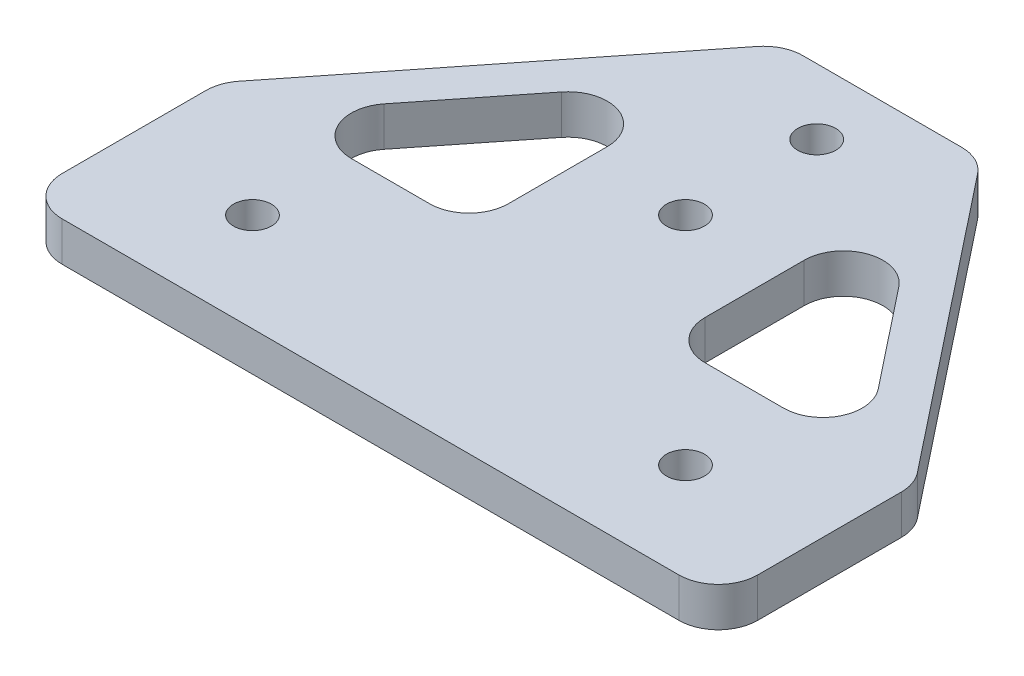
ISO-10303-21;
HEADER;
FILE_DESCRIPTION(('STEP AP214'),'2;1');
FILE_NAME('part.step','',(''),(''),'','','');
FILE_SCHEMA(('AUTOMOTIVE_DESIGN { 1 0 10303 214 1 1 1 1 }'));
ENDSEC;
DATA;
#1=APPLICATION_CONTEXT('core data for automotive mechanical design processes');
#2=APPLICATION_PROTOCOL_DEFINITION('international standard','automotive_design',2000,#1);
#3=PRODUCT_CONTEXT('',#1,'mechanical');
#4=PRODUCT('Part','Part','',(#3));
#5=PRODUCT_RELATED_PRODUCT_CATEGORY('part','',(#4));
#6=PRODUCT_DEFINITION_FORMATION('','',#4);
#7=PRODUCT_DEFINITION_CONTEXT('part definition',#1,'design');
#8=PRODUCT_DEFINITION('design','',#6,#7);
#9=PRODUCT_DEFINITION_SHAPE('','',#8);
#10=(LENGTH_UNIT() NAMED_UNIT(*) SI_UNIT(.MILLI.,.METRE.));
#11=(NAMED_UNIT(*) PLANE_ANGLE_UNIT() SI_UNIT($,.RADIAN.));
#12=(NAMED_UNIT(*) SI_UNIT($,.STERADIAN.) SOLID_ANGLE_UNIT());
#13=UNCERTAINTY_MEASURE_WITH_UNIT(LENGTH_MEASURE(1.E-05),#10,'distance_accuracy_value','');
#14=(GEOMETRIC_REPRESENTATION_CONTEXT(3) GLOBAL_UNCERTAINTY_ASSIGNED_CONTEXT((#13)) GLOBAL_UNIT_ASSIGNED_CONTEXT((#10,
#11,#12)) REPRESENTATION_CONTEXT('',''));
#15=CARTESIAN_POINT('',(0.,0.,0.));
#16=DIRECTION('',(0.,0.,1.));
#17=DIRECTION('',(1.,0.,0.));
#18=AXIS2_PLACEMENT_3D('',#15,#16,#17);
#19=CARTESIAN_POINT('',(0.,3.,-7.5));
#20=DIRECTION('',(0.,0.,1.));
#21=DIRECTION('',(1.,0.,0.));
#22=AXIS2_PLACEMENT_3D('',#19,#20,#21);
#23=PLANE('',#22);
#24=DIRECTION('',(-1.,0.,0.));
#25=VECTOR('',#24,1.);
#26=CARTESIAN_POINT('',(0.,3.,-7.5));
#27=LINE('',#26,#25);
#28=CARTESIAN_POINT('',(16.472386067493,3.,-7.5));
#29=VERTEX_POINT('',#28);
#30=CARTESIAN_POINT('',(10.5,3.,-7.5));
#31=VERTEX_POINT('',#30);
#32=EDGE_CURVE('E224',#29,#31,#27,.T.);
#33=ORIENTED_EDGE('',*,*,#32,.F.);
#34=DIRECTION('',(0.,-1.,0.));
#35=VECTOR('',#34,1.);
#36=CARTESIAN_POINT('',(16.472386067493,0.,-7.5));
#37=LINE('',#36,#35);
#38=CARTESIAN_POINT('',(16.472386067493,0.,-7.5));
#39=VERTEX_POINT('',#38);
#40=EDGE_CURVE('E209',#29,#39,#37,.T.);
#41=ORIENTED_EDGE('',*,*,#40,.T.);
#42=DIRECTION('',(-1.,0.,0.));
#43=VECTOR('',#42,1.);
#44=CARTESIAN_POINT('',(0.,0.,-7.5));
#45=LINE('',#44,#43);
#46=CARTESIAN_POINT('',(10.5,0.,-7.5));
#47=VERTEX_POINT('',#46);
#48=EDGE_CURVE('E221',#39,#47,#45,.T.);
#49=ORIENTED_EDGE('',*,*,#48,.T.);
#50=DIRECTION('',(0.,-1.,0.));
#51=VECTOR('',#50,1.);
#52=CARTESIAN_POINT('',(10.5,3.,-7.5));
#53=LINE('',#52,#51);
#54=EDGE_CURVE('E226',#47,#31,#53,.F.);
#55=ORIENTED_EDGE('',*,*,#54,.T.);
#56=EDGE_LOOP('',(#33,#41,#49,#55));
#57=FACE_BOUND('',#56,.T.);
#58=ADVANCED_FACE('F43',(#57),#23,.F.);
#59=CARTESIAN_POINT('',(7.5,3.,0.));
#60=DIRECTION('',(-1.,0.,0.));
#61=DIRECTION('',(0.,0.,1.));
#62=AXIS2_PLACEMENT_3D('',#59,#60,#61);
#63=PLANE('',#62);
#64=DIRECTION('',(0.,0.,-1.));
#65=VECTOR('',#64,1.);
#66=CARTESIAN_POINT('',(7.5,0.,0.));
#67=LINE('',#66,#65);
#68=CARTESIAN_POINT('',(7.50000000000001,0.,-10.5));
#69=VERTEX_POINT('',#68);
#70=CARTESIAN_POINT('',(7.50000000000001,0.,-18.0440666115701));
#71=VERTEX_POINT('',#70);
#72=EDGE_CURVE('E230',#69,#71,#67,.T.);
#73=ORIENTED_EDGE('',*,*,#72,.T.);
#74=DIRECTION('',(0.,-1.,0.));
#75=VECTOR('',#74,1.);
#76=CARTESIAN_POINT('',(7.50000000000001,3.,-18.0440666115701));
#77=LINE('',#76,#75);
#78=CARTESIAN_POINT('',(7.50000000000001,3.,-18.0440666115701));
#79=VERTEX_POINT('',#78);
#80=EDGE_CURVE('E251',#71,#79,#77,.F.);
#81=ORIENTED_EDGE('',*,*,#80,.T.);
#82=DIRECTION('',(0.,0.,-1.));
#83=VECTOR('',#82,1.);
#84=CARTESIAN_POINT('',(7.5,3.,0.));
#85=LINE('',#84,#83);
#86=CARTESIAN_POINT('',(7.50000000000001,3.,-10.5));
#87=VERTEX_POINT('',#86);
#88=EDGE_CURVE('E410',#87,#79,#85,.T.);
#89=ORIENTED_EDGE('',*,*,#88,.F.);
#90=DIRECTION('',(0.,-1.,0.));
#91=VECTOR('',#90,1.);
#92=CARTESIAN_POINT('',(7.50000000000001,0.,-10.5));
#93=LINE('',#92,#91);
#94=EDGE_CURVE('E248',#87,#69,#93,.T.);
#95=ORIENTED_EDGE('',*,*,#94,.T.);
#96=EDGE_LOOP('',(#73,#81,#89,#95));
#97=FACE_BOUND('',#96,.T.);
#98=ADVANCED_FACE('F448',(#97),#63,.F.);
#99=CARTESIAN_POINT('',(19.940234791889,3.,-15.7860192102455));
#100=DIRECTION('',(0.784045824461762,0.,-0.620702944365561));
#101=DIRECTION('',(-0.620702944365561,0.,-0.784045824461762));
#102=AXIS2_PLACEMENT_3D('',#99,#100,#101);
#103=PLANE('',#102);
#104=DIRECTION('',(0.620702944365561,0.,0.784045824461762));
#105=VECTOR('',#104,1.);
#106=CARTESIAN_POINT('',(19.940234791889,0.,-15.7860192102455));
#107=LINE('',#106,#105);
#108=CARTESIAN_POINT('',(8.40083050713179,0.,-30.3621088330967));
#109=VERTEX_POINT('',#108);
#110=CARTESIAN_POINT('',(25.8521374733853,0.,-8.31835266519753));
#111=VERTEX_POINT('',#110);
#112=EDGE_CURVE('E376',#109,#111,#107,.T.);
#113=ORIENTED_EDGE('',*,*,#112,.F.);
#114=DIRECTION('',(0.,-1.,0.));
#115=VECTOR('',#114,1.);
#116=CARTESIAN_POINT('',(8.40083050713179,3.,-30.3621088330967));
#117=LINE('',#116,#115);
#118=CARTESIAN_POINT('',(8.40083050713179,3.,-30.3621088330967));
#119=VERTEX_POINT('',#118);
#120=EDGE_CURVE('E303',#109,#119,#117,.F.);
#121=ORIENTED_EDGE('',*,*,#120,.T.);
#122=DIRECTION('',(0.620702944365561,0.,0.784045824461762));
#123=VECTOR('',#122,1.);
#124=CARTESIAN_POINT('',(19.940234791889,3.,-15.7860192102455));
#125=LINE('',#124,#123);
#126=CARTESIAN_POINT('',(25.8521374733853,3.,-8.31835266519753));
#127=VERTEX_POINT('',#126);
#128=EDGE_CURVE('E732',#119,#127,#125,.T.);
#129=ORIENTED_EDGE('',*,*,#128,.T.);
#130=DIRECTION('',(0.,-1.,0.));
#131=VECTOR('',#130,1.);
#132=CARTESIAN_POINT('',(25.8521374733853,0.,-8.31835266519753));
#133=LINE('',#132,#131);
#134=EDGE_CURVE('E300',#127,#111,#133,.T.);
#135=ORIENTED_EDGE('',*,*,#134,.T.);
#136=EDGE_LOOP('',(#113,#121,#129,#135));
#137=FACE_BOUND('',#136,.T.);
#138=ADVANCED_FACE('F454',(#137),#103,.T.);
#139=CARTESIAN_POINT('',(0.,3.,-31.5));
#140=DIRECTION('',(0.,0.,-1.));
#141=DIRECTION('',(-1.,0.,0.));
#142=AXIS2_PLACEMENT_3D('',#139,#140,#141);
#143=PLANE('',#142);
#144=DIRECTION('',(1.,0.,0.));
#145=VECTOR('',#144,1.);
#146=CARTESIAN_POINT('',(0.,0.,-31.5));
#147=LINE('',#146,#145);
#148=CARTESIAN_POINT('',(-6.04869303374651,0.,-31.5));
#149=VERTEX_POINT('',#148);
#150=CARTESIAN_POINT('',(6.0486930337465,0.,-31.5));
#151=VERTEX_POINT('',#150);
#152=EDGE_CURVE('E379',#149,#151,#147,.T.);
#153=ORIENTED_EDGE('',*,*,#152,.F.);
#154=DIRECTION('',(0.,-1.,0.));
#155=VECTOR('',#154,1.);
#156=CARTESIAN_POINT('',(-6.04869303374651,3.,-31.5));
#157=LINE('',#156,#155);
#158=CARTESIAN_POINT('',(-6.04869303374651,3.,-31.5));
#159=VERTEX_POINT('',#158);
#160=EDGE_CURVE('E298',#149,#159,#157,.F.);
#161=ORIENTED_EDGE('',*,*,#160,.T.);
#162=DIRECTION('',(1.,0.,0.));
#163=VECTOR('',#162,1.);
#164=CARTESIAN_POINT('',(0.,3.,-31.5));
#165=LINE('',#164,#163);
#166=CARTESIAN_POINT('',(6.0486930337465,3.,-31.5));
#167=VERTEX_POINT('',#166);
#168=EDGE_CURVE('E735',#159,#167,#165,.T.);
#169=ORIENTED_EDGE('',*,*,#168,.T.);
#170=DIRECTION('',(0.,-1.,0.));
#171=VECTOR('',#170,1.);
#172=CARTESIAN_POINT('',(6.0486930337465,3.,-31.5));
#173=LINE('',#172,#171);
#174=EDGE_CURVE('E295',#167,#151,#173,.T.);
#175=ORIENTED_EDGE('',*,*,#174,.T.);
#176=EDGE_LOOP('',(#153,#161,#169,#175));
#177=FACE_BOUND('',#176,.T.);
#178=ADVANCED_FACE('F469',(#177),#143,.T.);
#179=CARTESIAN_POINT('',(-19.940234791889,3.,-15.7860192102455));
#180=DIRECTION('',(-0.784045824461761,0.,-0.620702944365561));
#181=DIRECTION('',(-0.620702944365561,0.,0.784045824461762));
#182=AXIS2_PLACEMENT_3D('',#179,#180,#181);
#183=PLANE('',#182);
#184=DIRECTION('',(0.620702944365561,0.,-0.784045824461762));
#185=VECTOR('',#184,1.);
#186=CARTESIAN_POINT('',(-19.940234791889,0.,-15.7860192102455));
#187=LINE('',#186,#185);
#188=CARTESIAN_POINT('',(-25.8521374733853,0.,-8.31835266519753));
#189=VERTEX_POINT('',#188);
#190=CARTESIAN_POINT('',(-8.40083050713179,0.,-30.3621088330967));
#191=VERTEX_POINT('',#190);
#192=EDGE_CURVE('E382',#189,#191,#187,.T.);
#193=ORIENTED_EDGE('',*,*,#192,.F.);
#194=DIRECTION('',(0.,-1.,0.));
#195=VECTOR('',#194,1.);
#196=CARTESIAN_POINT('',(-25.8521374733853,3.,-8.31835266519753));
#197=LINE('',#196,#195);
#198=CARTESIAN_POINT('',(-25.8521374733853,3.,-8.31835266519753));
#199=VERTEX_POINT('',#198);
#200=EDGE_CURVE('E293',#189,#199,#197,.F.);
#201=ORIENTED_EDGE('',*,*,#200,.T.);
#202=DIRECTION('',(0.620702944365561,0.,-0.784045824461762));
#203=VECTOR('',#202,1.);
#204=CARTESIAN_POINT('',(-19.940234791889,3.,-15.7860192102455));
#205=LINE('',#204,#203);
#206=CARTESIAN_POINT('',(-8.40083050713179,3.,-30.3621088330967));
#207=VERTEX_POINT('',#206);
#208=EDGE_CURVE('E738',#199,#207,#205,.T.);
#209=ORIENTED_EDGE('',*,*,#208,.T.);
#210=DIRECTION('',(0.,-1.,0.));
#211=VECTOR('',#210,1.);
#212=CARTESIAN_POINT('',(-8.40083050713179,3.,-30.3621088330967));
#213=LINE('',#212,#211);
#214=EDGE_CURVE('E290',#207,#191,#213,.T.);
#215=ORIENTED_EDGE('',*,*,#214,.T.);
#216=EDGE_LOOP('',(#193,#201,#209,#215));
#217=FACE_BOUND('',#216,.T.);
#218=ADVANCED_FACE('F466',(#217),#183,.T.);
#219=CARTESIAN_POINT('',(-26.5,3.,0.));
#220=DIRECTION('',(-1.,0.,0.));
#221=DIRECTION('',(0.,0.,1.));
#222=AXIS2_PLACEMENT_3D('',#219,#220,#221);
#223=PLANE('',#222);
#224=DIRECTION('',(0.,0.,-1.));
#225=VECTOR('',#224,1.);
#226=CARTESIAN_POINT('',(-26.5,0.,0.));
#227=LINE('',#226,#225);
#228=CARTESIAN_POINT('',(-26.5,0.,4.5));
#229=VERTEX_POINT('',#228);
#230=CARTESIAN_POINT('',(-26.5,0.,-6.45624383210085));
#231=VERTEX_POINT('',#230);
#232=EDGE_CURVE('E385',#229,#231,#227,.T.);
#233=ORIENTED_EDGE('',*,*,#232,.F.);
#234=DIRECTION('',(0.,-1.,0.));
#235=VECTOR('',#234,1.);
#236=CARTESIAN_POINT('',(-26.5,3.,4.5));
#237=LINE('',#236,#235);
#238=CARTESIAN_POINT('',(-26.5,3.,4.5));
#239=VERTEX_POINT('',#238);
#240=EDGE_CURVE('E65',#229,#239,#237,.F.);
#241=ORIENTED_EDGE('',*,*,#240,.T.);
#242=DIRECTION('',(0.,0.,-1.));
#243=VECTOR('',#242,1.);
#244=CARTESIAN_POINT('',(-26.5,3.,0.));
#245=LINE('',#244,#243);
#246=CARTESIAN_POINT('',(-26.5,3.,-6.45624383210085));
#247=VERTEX_POINT('',#246);
#248=EDGE_CURVE('E412',#239,#247,#245,.T.);
#249=ORIENTED_EDGE('',*,*,#248,.T.);
#250=DIRECTION('',(0.,-1.,0.));
#251=VECTOR('',#250,1.);
#252=CARTESIAN_POINT('',(-26.5,3.,-6.45624383210085));
#253=LINE('',#252,#251);
#254=EDGE_CURVE('E286',#247,#231,#253,.T.);
#255=ORIENTED_EDGE('',*,*,#254,.T.);
#256=EDGE_LOOP('',(#233,#241,#249,#255));
#257=FACE_BOUND('',#256,.T.);
#258=ADVANCED_FACE('F463',(#257),#223,.T.);
#259=CARTESIAN_POINT('',(0.,3.,7.5));
#260=DIRECTION('',(0.,0.,-1.));
#261=DIRECTION('',(-1.,0.,0.));
#262=AXIS2_PLACEMENT_3D('',#259,#260,#261);
#263=PLANE('',#262);
#264=DIRECTION('',(1.,0.,0.));
#265=VECTOR('',#264,1.);
#266=CARTESIAN_POINT('',(0.,0.,7.5));
#267=LINE('',#266,#265);
#268=CARTESIAN_POINT('',(-23.5,0.,7.5));
#269=VERTEX_POINT('',#268);
#270=CARTESIAN_POINT('',(23.5,0.,7.5));
#271=VERTEX_POINT('',#270);
#272=EDGE_CURVE('E237',#269,#271,#267,.T.);
#273=ORIENTED_EDGE('',*,*,#272,.T.);
#274=DIRECTION('',(0.,-1.,0.));
#275=VECTOR('',#274,1.);
#276=CARTESIAN_POINT('',(23.5,3.,7.5));
#277=LINE('',#276,#275);
#278=CARTESIAN_POINT('',(23.5,3.,7.5));
#279=VERTEX_POINT('',#278);
#280=EDGE_CURVE('E273',#271,#279,#277,.F.);
#281=ORIENTED_EDGE('',*,*,#280,.T.);
#282=DIRECTION('',(1.,0.,0.));
#283=VECTOR('',#282,1.);
#284=CARTESIAN_POINT('',(0.,3.,7.5));
#285=LINE('',#284,#283);
#286=CARTESIAN_POINT('',(-23.5,3.,7.5));
#287=VERTEX_POINT('',#286);
#288=EDGE_CURVE('E404',#287,#279,#285,.T.);
#289=ORIENTED_EDGE('',*,*,#288,.F.);
#290=DIRECTION('',(0.,-1.,0.));
#291=VECTOR('',#290,1.);
#292=CARTESIAN_POINT('',(-23.5,0.,7.5));
#293=LINE('',#292,#291);
#294=EDGE_CURVE('E270',#287,#269,#293,.T.);
#295=ORIENTED_EDGE('',*,*,#294,.T.);
#296=EDGE_LOOP('',(#273,#281,#289,#295));
#297=FACE_BOUND('',#296,.T.);
#298=ADVANCED_FACE('F391',(#297),#263,.F.);
#299=CARTESIAN_POINT('',(-7.5,3.,0.));
#300=DIRECTION('',(-1.,0.,0.));
#301=DIRECTION('',(0.,0.,1.));
#302=AXIS2_PLACEMENT_3D('',#299,#300,#301);
#303=PLANE('',#302);
#304=DIRECTION('',(0.,0.,-1.));
#305=VECTOR('',#304,1.);
#306=CARTESIAN_POINT('',(-7.5,3.,0.));
#307=LINE('',#306,#305);
#308=CARTESIAN_POINT('',(-7.5,3.,-10.5));
#309=VERTEX_POINT('',#308);
#310=CARTESIAN_POINT('',(-7.5,3.,-18.0440666115701));
#311=VERTEX_POINT('',#310);
#312=EDGE_CURVE('E344',#309,#311,#307,.T.);
#313=ORIENTED_EDGE('',*,*,#312,.T.);
#314=DIRECTION('',(0.,-1.,0.));
#315=VECTOR('',#314,1.);
#316=CARTESIAN_POINT('',(-7.5,0.,-18.0440666115701));
#317=LINE('',#316,#315);
#318=CARTESIAN_POINT('',(-7.5,0.,-18.0440666115701));
#319=VERTEX_POINT('',#318);
#320=EDGE_CURVE('E307',#311,#319,#317,.T.);
#321=ORIENTED_EDGE('',*,*,#320,.T.);
#322=DIRECTION('',(0.,0.,-1.));
#323=VECTOR('',#322,1.);
#324=CARTESIAN_POINT('',(-7.5,0.,0.));
#325=LINE('',#324,#323);
#326=CARTESIAN_POINT('',(-7.5,0.,-10.5));
#327=VERTEX_POINT('',#326);
#328=EDGE_CURVE('E360',#327,#319,#325,.T.);
#329=ORIENTED_EDGE('',*,*,#328,.F.);
#330=DIRECTION('',(0.,-1.,0.));
#331=VECTOR('',#330,1.);
#332=CARTESIAN_POINT('',(-7.5,3.,-10.5));
#333=LINE('',#332,#331);
#334=EDGE_CURVE('E305',#327,#309,#333,.F.);
#335=ORIENTED_EDGE('',*,*,#334,.T.);
#336=EDGE_LOOP('',(#313,#321,#329,#335));
#337=FACE_BOUND('',#336,.T.);
#338=ADVANCED_FACE('F363',(#337),#303,.T.);
#339=CARTESIAN_POINT('',(0.,3.,-7.5));
#340=DIRECTION('',(0.,0.,-1.));
#341=DIRECTION('',(-1.,0.,0.));
#342=AXIS2_PLACEMENT_3D('',#339,#340,#341);
#343=PLANE('',#342);
#344=DIRECTION('',(1.,0.,0.));
#345=VECTOR('',#344,1.);
#346=CARTESIAN_POINT('',(0.,0.,-7.5));
#347=LINE('',#346,#345);
#348=CARTESIAN_POINT('',(-16.472386067493,0.,-7.5));
#349=VERTEX_POINT('',#348);
#350=CARTESIAN_POINT('',(-10.5,0.,-7.5));
#351=VERTEX_POINT('',#350);
#352=EDGE_CURVE('E361',#349,#351,#347,.T.);
#353=ORIENTED_EDGE('',*,*,#352,.F.);
#354=DIRECTION('',(0.,-1.,0.));
#355=VECTOR('',#354,1.);
#356=CARTESIAN_POINT('',(-16.472386067493,3.,-7.5));
#357=LINE('',#356,#355);
#358=CARTESIAN_POINT('',(-16.472386067493,3.,-7.5));
#359=VERTEX_POINT('',#358);
#360=EDGE_CURVE('E216',#349,#359,#357,.F.);
#361=ORIENTED_EDGE('',*,*,#360,.T.);
#362=DIRECTION('',(1.,0.,0.));
#363=VECTOR('',#362,1.);
#364=CARTESIAN_POINT('',(0.,3.,-7.5));
#365=LINE('',#364,#363);
#366=CARTESIAN_POINT('',(-10.5,3.,-7.5));
#367=VERTEX_POINT('',#366);
#368=EDGE_CURVE('E341',#359,#367,#365,.T.);
#369=ORIENTED_EDGE('',*,*,#368,.T.);
#370=DIRECTION('',(0.,-1.,0.));
#371=VECTOR('',#370,1.);
#372=CARTESIAN_POINT('',(-10.5,0.,-7.5));
#373=LINE('',#372,#371);
#374=EDGE_CURVE('E315',#367,#351,#373,.T.);
#375=ORIENTED_EDGE('',*,*,#374,.T.);
#376=EDGE_LOOP('',(#353,#361,#369,#375));
#377=FACE_BOUND('',#376,.T.);
#378=ADVANCED_FACE('F350',(#377),#343,.T.);
#379=CARTESIAN_POINT('',(26.5,3.,0.));
#380=DIRECTION('',(-1.,0.,0.));
#381=DIRECTION('',(0.,0.,1.));
#382=AXIS2_PLACEMENT_3D('',#379,#380,#381);
#383=PLANE('',#382);
#384=DIRECTION('',(0.,0.,-1.));
#385=VECTOR('',#384,1.);
#386=CARTESIAN_POINT('',(26.5,3.,0.));
#387=LINE('',#386,#385);
#388=CARTESIAN_POINT('',(26.5,3.,4.5));
#389=VERTEX_POINT('',#388);
#390=CARTESIAN_POINT('',(26.5,3.,-6.45624383210085));
#391=VERTEX_POINT('',#390);
#392=EDGE_CURVE('E402',#389,#391,#387,.T.);
#393=ORIENTED_EDGE('',*,*,#392,.F.);
#394=DIRECTION('',(0.,-1.,0.));
#395=VECTOR('',#394,1.);
#396=CARTESIAN_POINT('',(26.5,3.,4.5));
#397=LINE('',#396,#395);
#398=CARTESIAN_POINT('',(26.5,0.,4.5));
#399=VERTEX_POINT('',#398);
#400=EDGE_CURVE('E255',#389,#399,#397,.T.);
#401=ORIENTED_EDGE('',*,*,#400,.T.);
#402=DIRECTION('',(0.,0.,-1.));
#403=VECTOR('',#402,1.);
#404=CARTESIAN_POINT('',(26.5,0.,0.));
#405=LINE('',#404,#403);
#406=CARTESIAN_POINT('',(26.5,0.,-6.45624383210085));
#407=VERTEX_POINT('',#406);
#408=EDGE_CURVE('E231',#399,#407,#405,.T.);
#409=ORIENTED_EDGE('',*,*,#408,.T.);
#410=DIRECTION('',(0.,-1.,0.));
#411=VECTOR('',#410,1.);
#412=CARTESIAN_POINT('',(26.5,3.,-6.45624383210085));
#413=LINE('',#412,#411);
#414=EDGE_CURVE('E253',#407,#391,#413,.F.);
#415=ORIENTED_EDGE('',*,*,#414,.T.);
#416=EDGE_LOOP('',(#393,#401,#409,#415));
#417=FACE_BOUND('',#416,.T.);
#418=ADVANCED_FACE('F406',(#417),#383,.F.);
#419=CARTESIAN_POINT('',(-17.5880973185037,3.,-13.9239103771488));
#420=DIRECTION('',(0.784045824461761,0.,0.620702944365561));
#421=DIRECTION('',(0.620702944365561,0.,-0.784045824461762));
#422=AXIS2_PLACEMENT_3D('',#419,#420,#421);
#423=PLANE('',#422);
#424=DIRECTION('',(-0.620702944365561,0.,0.784045824461762));
#425=VECTOR('',#424,1.);
#426=CARTESIAN_POINT('',(-17.5880973185037,0.,-13.9239103771488));
#427=LINE('',#426,#425);
#428=CARTESIAN_POINT('',(-12.8521374733853,0.,-19.9061754446668));
#429=VERTEX_POINT('',#428);
#430=CARTESIAN_POINT('',(-18.8245235408783,0.,-12.3621088330967));
#431=VERTEX_POINT('',#430);
#432=EDGE_CURVE('E367',#429,#431,#427,.T.);
#433=ORIENTED_EDGE('',*,*,#432,.F.);
#434=DIRECTION('',(0.,-1.,0.));
#435=VECTOR('',#434,1.);
#436=CARTESIAN_POINT('',(-12.8521374733853,3.,-19.9061754446668));
#437=LINE('',#436,#435);
#438=CARTESIAN_POINT('',(-12.8521374733853,3.,-19.9061754446668));
#439=VERTEX_POINT('',#438);
#440=EDGE_CURVE('E313',#429,#439,#437,.F.);
#441=ORIENTED_EDGE('',*,*,#440,.T.);
#442=DIRECTION('',(-0.620702944365561,0.,0.784045824461762));
#443=VECTOR('',#442,1.);
#444=CARTESIAN_POINT('',(-17.5880973185037,3.,-13.9239103771488));
#445=LINE('',#444,#443);
#446=CARTESIAN_POINT('',(-18.8245235408783,3.,-12.3621088330967));
#447=VERTEX_POINT('',#446);
#448=EDGE_CURVE('E353',#439,#447,#445,.T.);
#449=ORIENTED_EDGE('',*,*,#448,.T.);
#450=DIRECTION('',(0.,-1.,0.));
#451=VECTOR('',#450,1.);
#452=CARTESIAN_POINT('',(-18.8245235408783,0.,-12.3621088330967));
#453=LINE('',#452,#451);
#454=EDGE_CURVE('E310',#447,#431,#453,.T.);
#455=ORIENTED_EDGE('',*,*,#454,.T.);
#456=EDGE_LOOP('',(#433,#441,#449,#455));
#457=FACE_BOUND('',#456,.T.);
#458=ADVANCED_FACE('F443',(#457),#423,.T.);
#459=CARTESIAN_POINT('',(-16.5,3.,0.));
#460=DIRECTION('',(0.,-1.,0.));
#461=DIRECTION('',(0.,0.,-1.));
#462=AXIS2_PLACEMENT_3D('',#459,#460,#461);
#463=CYLINDRICAL_SURFACE('',#462,1.45);
#464=CARTESIAN_POINT('',(-16.5,3.,0.));
#465=DIRECTION('',(0.,1.,0.));
#466=DIRECTION('',(0.,0.,1.));
#467=AXIS2_PLACEMENT_3D('',#464,#465,#466);
#468=CIRCLE('',#467,1.45);
#469=CARTESIAN_POINT('',(-16.5,3.,1.45));
#470=VERTEX_POINT('',#469);
#471=EDGE_CURVE('E726',#470,#470,#468,.T.);
#472=ORIENTED_EDGE('',*,*,#471,.T.);
#473=EDGE_LOOP('',(#472));
#474=FACE_BOUND('',#473,.T.);
#475=CARTESIAN_POINT('',(-16.5,0.,0.));
#476=DIRECTION('',(0.,1.,0.));
#477=DIRECTION('',(0.,0.,1.));
#478=AXIS2_PLACEMENT_3D('',#475,#476,#477);
#479=CIRCLE('',#478,1.45);
#480=CARTESIAN_POINT('',(-16.5,0.,1.45));
#481=VERTEX_POINT('',#480);
#482=EDGE_CURVE('E365',#481,#481,#479,.T.);
#483=ORIENTED_EDGE('',*,*,#482,.F.);
#484=EDGE_LOOP('',(#483));
#485=FACE_BOUND('',#484,.T.);
#486=ADVANCED_FACE('F433',(#474,#485),#463,.F.);
#487=CARTESIAN_POINT('',(16.5,3.,0.));
#488=DIRECTION('',(0.,-1.,0.));
#489=DIRECTION('',(0.,0.,-1.));
#490=AXIS2_PLACEMENT_3D('',#487,#488,#489);
#491=CYLINDRICAL_SURFACE('',#490,1.45);
#492=CARTESIAN_POINT('',(16.5,3.,0.));
#493=DIRECTION('',(0.,1.,0.));
#494=DIRECTION('',(0.,0.,1.));
#495=AXIS2_PLACEMENT_3D('',#492,#493,#494);
#496=CIRCLE('',#495,1.45);
#497=CARTESIAN_POINT('',(16.5,3.,1.45));
#498=VERTEX_POINT('',#497);
#499=EDGE_CURVE('E722',#498,#498,#496,.T.);
#500=ORIENTED_EDGE('',*,*,#499,.T.);
#501=EDGE_LOOP('',(#500));
#502=FACE_BOUND('',#501,.T.);
#503=CARTESIAN_POINT('',(16.5,0.,0.));
#504=DIRECTION('',(0.,1.,0.));
#505=DIRECTION('',(0.,0.,1.));
#506=AXIS2_PLACEMENT_3D('',#503,#504,#505);
#507=CIRCLE('',#506,1.45);
#508=CARTESIAN_POINT('',(16.5,0.,1.45));
#509=VERTEX_POINT('',#508);
#510=EDGE_CURVE('E370',#509,#509,#507,.T.);
#511=ORIENTED_EDGE('',*,*,#510,.F.);
#512=EDGE_LOOP('',(#511));
#513=FACE_BOUND('',#512,.T.);
#514=ADVANCED_FACE('F430',(#502,#513),#491,.F.);
#515=CARTESIAN_POINT('',(0.,3.,-16.5));
#516=DIRECTION('',(0.,-1.,0.));
#517=DIRECTION('',(0.,0.,-1.));
#518=AXIS2_PLACEMENT_3D('',#515,#516,#517);
#519=CYLINDRICAL_SURFACE('',#518,1.45);
#520=CARTESIAN_POINT('',(0.,3.,-16.5));
#521=DIRECTION('',(0.,1.,0.));
#522=DIRECTION('',(0.,0.,1.));
#523=AXIS2_PLACEMENT_3D('',#520,#521,#522);
#524=CIRCLE('',#523,1.45);
#525=CARTESIAN_POINT('',(0.,3.,-15.05));
#526=VERTEX_POINT('',#525);
#527=EDGE_CURVE('E719',#526,#526,#524,.T.);
#528=ORIENTED_EDGE('',*,*,#527,.T.);
#529=EDGE_LOOP('',(#528));
#530=FACE_BOUND('',#529,.T.);
#531=CARTESIAN_POINT('',(0.,0.,-16.5));
#532=DIRECTION('',(0.,1.,0.));
#533=DIRECTION('',(0.,0.,1.));
#534=AXIS2_PLACEMENT_3D('',#531,#532,#533);
#535=CIRCLE('',#534,1.45);
#536=CARTESIAN_POINT('',(0.,0.,-15.05));
#537=VERTEX_POINT('',#536);
#538=EDGE_CURVE('E423',#537,#537,#535,.T.);
#539=ORIENTED_EDGE('',*,*,#538,.F.);
#540=EDGE_LOOP('',(#539));
#541=FACE_BOUND('',#540,.T.);
#542=ADVANCED_FACE('F432',(#530,#541),#519,.F.);
#543=CARTESIAN_POINT('',(0.,3.,-26.5));
#544=DIRECTION('',(0.,-1.,0.));
#545=DIRECTION('',(0.,0.,-1.));
#546=AXIS2_PLACEMENT_3D('',#543,#544,#545);
#547=CYLINDRICAL_SURFACE('',#546,1.45);
#548=CARTESIAN_POINT('',(0.,3.,-26.5));
#549=DIRECTION('',(0.,1.,0.));
#550=DIRECTION('',(0.,0.,1.));
#551=AXIS2_PLACEMENT_3D('',#548,#549,#550);
#552=CIRCLE('',#551,1.45);
#553=CARTESIAN_POINT('',(0.,3.,-25.05));
#554=VERTEX_POINT('',#553);
#555=EDGE_CURVE('E242',#554,#554,#552,.T.);
#556=ORIENTED_EDGE('',*,*,#555,.T.);
#557=EDGE_LOOP('',(#556));
#558=FACE_BOUND('',#557,.T.);
#559=CARTESIAN_POINT('',(0.,0.,-26.5));
#560=DIRECTION('',(0.,1.,0.));
#561=DIRECTION('',(0.,0.,1.));
#562=AXIS2_PLACEMENT_3D('',#559,#560,#561);
#563=CIRCLE('',#562,1.45);
#564=CARTESIAN_POINT('',(0.,0.,-25.05));
#565=VERTEX_POINT('',#564);
#566=EDGE_CURVE('E420',#565,#565,#563,.T.);
#567=ORIENTED_EDGE('',*,*,#566,.F.);
#568=EDGE_LOOP('',(#567));
#569=FACE_BOUND('',#568,.T.);
#570=ADVANCED_FACE('F440',(#558,#569),#547,.F.);
#571=CARTESIAN_POINT('',(17.5880973185037,3.,-13.9239103771488));
#572=DIRECTION('',(0.784045824461761,0.,-0.620702944365561));
#573=DIRECTION('',(-0.620702944365561,0.,-0.784045824461762));
#574=AXIS2_PLACEMENT_3D('',#571,#572,#573);
#575=PLANE('',#574);
#576=DIRECTION('',(0.620702944365561,0.,0.784045824461762));
#577=VECTOR('',#576,1.);
#578=CARTESIAN_POINT('',(17.5880973185037,0.,-13.9239103771488));
#579=LINE('',#578,#577);
#580=CARTESIAN_POINT('',(12.8521374733853,0.,-19.9061754446668));
#581=VERTEX_POINT('',#580);
#582=CARTESIAN_POINT('',(18.8245235408783,0.,-12.3621088330967));
#583=VERTEX_POINT('',#582);
#584=EDGE_CURVE('E234',#581,#583,#579,.T.);
#585=ORIENTED_EDGE('',*,*,#584,.T.);
#586=DIRECTION('',(0.,-1.,0.));
#587=VECTOR('',#586,1.);
#588=CARTESIAN_POINT('',(18.8245235408783,3.,-12.3621088330967));
#589=LINE('',#588,#587);
#590=CARTESIAN_POINT('',(18.8245235408783,3.,-12.3621088330967));
#591=VERTEX_POINT('',#590);
#592=EDGE_CURVE('E210',#583,#591,#589,.F.);
#593=ORIENTED_EDGE('',*,*,#592,.T.);
#594=DIRECTION('',(0.620702944365561,0.,0.784045824461762));
#595=VECTOR('',#594,1.);
#596=CARTESIAN_POINT('',(17.5880973185037,3.,-13.9239103771488));
#597=LINE('',#596,#595);
#598=CARTESIAN_POINT('',(12.8521374733853,3.,-19.9061754446668));
#599=VERTEX_POINT('',#598);
#600=EDGE_CURVE('E243',#599,#591,#597,.T.);
#601=ORIENTED_EDGE('',*,*,#600,.F.);
#602=DIRECTION('',(0.,-1.,0.));
#603=VECTOR('',#602,1.);
#604=CARTESIAN_POINT('',(12.8521374733853,0.,-19.9061754446668));
#605=LINE('',#604,#603);
#606=EDGE_CURVE('E225',#599,#581,#605,.T.);
#607=ORIENTED_EDGE('',*,*,#606,.T.);
#608=EDGE_LOOP('',(#585,#593,#601,#607));
#609=FACE_BOUND('',#608,.T.);
#610=ADVANCED_FACE('F507',(#609),#575,.F.);
#611=CARTESIAN_POINT('',(0.,3.,0.));
#612=DIRECTION('',(0.,1.,0.));
#613=DIRECTION('',(0.,0.,1.));
#614=AXIS2_PLACEMENT_3D('',#611,#612,#613);
#615=PLANE('',#614);
#616=ORIENTED_EDGE('',*,*,#555,.F.);
#617=EDGE_LOOP('',(#616));
#618=FACE_BOUND('',#617,.T.);
#619=ORIENTED_EDGE('',*,*,#527,.F.);
#620=EDGE_LOOP('',(#619));
#621=FACE_BOUND('',#620,.T.);
#622=ORIENTED_EDGE('',*,*,#499,.F.);
#623=EDGE_LOOP('',(#622));
#624=FACE_BOUND('',#623,.T.);
#625=ORIENTED_EDGE('',*,*,#471,.F.);
#626=EDGE_LOOP('',(#625));
#627=FACE_BOUND('',#626,.T.);
#628=ORIENTED_EDGE('',*,*,#312,.F.);
#629=CARTESIAN_POINT('',(-10.5,3.,-10.5));
#630=DIRECTION('',(0.,1.,0.));
#631=DIRECTION('',(0.,0.,1.));
#632=AXIS2_PLACEMENT_3D('',#629,#630,#631);
#633=CIRCLE('',#632,3.);
#634=EDGE_CURVE('E334',#309,#367,#633,.F.);
#635=ORIENTED_EDGE('',*,*,#634,.T.);
#636=ORIENTED_EDGE('',*,*,#368,.F.);
#637=CARTESIAN_POINT('',(-16.472386067493,3.,-10.5));
#638=DIRECTION('',(0.,1.,0.));
#639=DIRECTION('',(0.,0.,1.));
#640=AXIS2_PLACEMENT_3D('',#637,#638,#639);
#641=CIRCLE('',#640,3.);
#642=EDGE_CURVE('E330',#359,#447,#641,.F.);
#643=ORIENTED_EDGE('',*,*,#642,.T.);
#644=ORIENTED_EDGE('',*,*,#448,.F.);
#645=CARTESIAN_POINT('',(-10.5,3.,-18.0440666115701));
#646=DIRECTION('',(0.,1.,0.));
#647=DIRECTION('',(0.,0.,1.));
#648=AXIS2_PLACEMENT_3D('',#645,#646,#647);
#649=CIRCLE('',#648,3.);
#650=EDGE_CURVE('E326',#439,#311,#649,.F.);
#651=ORIENTED_EDGE('',*,*,#650,.T.);
#652=EDGE_LOOP('',(#628,#635,#636,#643,#644,#651));
#653=FACE_BOUND('',#652,.T.);
#654=ORIENTED_EDGE('',*,*,#288,.T.);
#655=CARTESIAN_POINT('',(23.5,3.,4.5));
#656=DIRECTION('',(0.,1.,0.));
#657=DIRECTION('',(0.,0.,1.));
#658=AXIS2_PLACEMENT_3D('',#655,#656,#657);
#659=CIRCLE('',#658,3.);
#660=EDGE_CURVE('E284',#279,#389,#659,.T.);
#661=ORIENTED_EDGE('',*,*,#660,.T.);
#662=ORIENTED_EDGE('',*,*,#392,.T.);
#663=CARTESIAN_POINT('',(23.5,3.,-6.45624383210085));
#664=DIRECTION('',(0.,1.,0.));
#665=DIRECTION('',(0.,0.,1.));
#666=AXIS2_PLACEMENT_3D('',#663,#664,#665);
#667=CIRCLE('',#666,3.);
#668=EDGE_CURVE('E275',#391,#127,#667,.T.);
#669=ORIENTED_EDGE('',*,*,#668,.T.);
#670=ORIENTED_EDGE('',*,*,#128,.F.);
#671=CARTESIAN_POINT('',(6.04869303374651,3.,-28.5));
#672=DIRECTION('',(0.,1.,0.));
#673=DIRECTION('',(0.,0.,1.));
#674=AXIS2_PLACEMENT_3D('',#671,#672,#673);
#675=CIRCLE('',#674,3.);
#676=EDGE_CURVE('E277',#119,#167,#675,.T.);
#677=ORIENTED_EDGE('',*,*,#676,.T.);
#678=ORIENTED_EDGE('',*,*,#168,.F.);
#679=CARTESIAN_POINT('',(-6.04869303374651,3.,-28.5));
#680=DIRECTION('',(0.,1.,0.));
#681=DIRECTION('',(0.,0.,1.));
#682=AXIS2_PLACEMENT_3D('',#679,#680,#681);
#683=CIRCLE('',#682,3.);
#684=EDGE_CURVE('E279',#159,#207,#683,.T.);
#685=ORIENTED_EDGE('',*,*,#684,.T.);
#686=ORIENTED_EDGE('',*,*,#208,.F.);
#687=CARTESIAN_POINT('',(-23.5,3.,-6.45624383210085));
#688=DIRECTION('',(0.,1.,0.));
#689=DIRECTION('',(0.,0.,1.));
#690=AXIS2_PLACEMENT_3D('',#687,#688,#689);
#691=CIRCLE('',#690,3.);
#692=EDGE_CURVE('E58',#199,#247,#691,.T.);
#693=ORIENTED_EDGE('',*,*,#692,.T.);
#694=ORIENTED_EDGE('',*,*,#248,.F.);
#695=CARTESIAN_POINT('',(-23.5,3.,4.5));
#696=DIRECTION('',(0.,1.,0.));
#697=DIRECTION('',(0.,0.,1.));
#698=AXIS2_PLACEMENT_3D('',#695,#696,#697);
#699=CIRCLE('',#698,3.);
#700=EDGE_CURVE('E282',#239,#287,#699,.T.);
#701=ORIENTED_EDGE('',*,*,#700,.T.);
#702=EDGE_LOOP('',(#654,#661,#662,#669,#670,#677,#678,#685,#686,#693,#694,#701));
#703=FACE_BOUND('',#702,.T.);
#704=ORIENTED_EDGE('',*,*,#600,.T.);
#705=CARTESIAN_POINT('',(16.472386067493,3.,-10.5));
#706=DIRECTION('',(0.,1.,0.));
#707=DIRECTION('',(0.,0.,1.));
#708=AXIS2_PLACEMENT_3D('',#705,#706,#707);
#709=CIRCLE('',#708,3.);
#710=EDGE_CURVE('E215',#591,#29,#709,.F.);
#711=ORIENTED_EDGE('',*,*,#710,.T.);
#712=ORIENTED_EDGE('',*,*,#32,.T.);
#713=CARTESIAN_POINT('',(10.5,3.,-10.5));
#714=DIRECTION('',(0.,1.,0.));
#715=DIRECTION('',(0.,0.,1.));
#716=AXIS2_PLACEMENT_3D('',#713,#714,#715);
#717=CIRCLE('',#716,3.);
#718=EDGE_CURVE('E11',#31,#87,#717,.F.);
#719=ORIENTED_EDGE('',*,*,#718,.T.);
#720=ORIENTED_EDGE('',*,*,#88,.T.);
#721=CARTESIAN_POINT('',(10.5,3.,-18.0440666115701));
#722=DIRECTION('',(0.,1.,0.));
#723=DIRECTION('',(0.,0.,1.));
#724=AXIS2_PLACEMENT_3D('',#721,#722,#723);
#725=CIRCLE('',#724,3.);
#726=EDGE_CURVE('E322',#79,#599,#725,.F.);
#727=ORIENTED_EDGE('',*,*,#726,.T.);
#728=EDGE_LOOP('',(#704,#711,#712,#719,#720,#727));
#729=FACE_BOUND('',#728,.T.);
#730=ADVANCED_FACE('F340',(#618,#621,#624,#627,#653,#703,#729),#615,.T.);
#731=CARTESIAN_POINT('',(0.,0.,0.));
#732=DIRECTION('',(0.,1.,0.));
#733=DIRECTION('',(0.,0.,1.));
#734=AXIS2_PLACEMENT_3D('',#731,#732,#733);
#735=PLANE('',#734);
#736=ORIENTED_EDGE('',*,*,#566,.T.);
#737=EDGE_LOOP('',(#736));
#738=FACE_BOUND('',#737,.T.);
#739=ORIENTED_EDGE('',*,*,#538,.T.);
#740=EDGE_LOOP('',(#739));
#741=FACE_BOUND('',#740,.T.);
#742=ORIENTED_EDGE('',*,*,#510,.T.);
#743=EDGE_LOOP('',(#742));
#744=FACE_BOUND('',#743,.T.);
#745=ORIENTED_EDGE('',*,*,#482,.T.);
#746=EDGE_LOOP('',(#745));
#747=FACE_BOUND('',#746,.T.);
#748=ORIENTED_EDGE('',*,*,#352,.T.);
#749=CARTESIAN_POINT('',(-10.5,0.,-10.5));
#750=DIRECTION('',(0.,1.,0.));
#751=DIRECTION('',(0.,0.,1.));
#752=AXIS2_PLACEMENT_3D('',#749,#750,#751);
#753=CIRCLE('',#752,3.);
#754=EDGE_CURVE('E332',#351,#327,#753,.T.);
#755=ORIENTED_EDGE('',*,*,#754,.T.);
#756=ORIENTED_EDGE('',*,*,#328,.T.);
#757=CARTESIAN_POINT('',(-10.5,0.,-18.0440666115701));
#758=DIRECTION('',(0.,1.,0.));
#759=DIRECTION('',(0.,0.,1.));
#760=AXIS2_PLACEMENT_3D('',#757,#758,#759);
#761=CIRCLE('',#760,3.);
#762=EDGE_CURVE('E324',#319,#429,#761,.T.);
#763=ORIENTED_EDGE('',*,*,#762,.T.);
#764=ORIENTED_EDGE('',*,*,#432,.T.);
#765=CARTESIAN_POINT('',(-16.472386067493,0.,-10.5));
#766=DIRECTION('',(0.,1.,0.));
#767=DIRECTION('',(0.,0.,1.));
#768=AXIS2_PLACEMENT_3D('',#765,#766,#767);
#769=CIRCLE('',#768,3.);
#770=EDGE_CURVE('E328',#431,#349,#769,.T.);
#771=ORIENTED_EDGE('',*,*,#770,.T.);
#772=EDGE_LOOP('',(#748,#755,#756,#763,#764,#771));
#773=FACE_BOUND('',#772,.T.);
#774=ORIENTED_EDGE('',*,*,#408,.F.);
#775=CARTESIAN_POINT('',(23.5,0.,4.5));
#776=DIRECTION('',(0.,1.,0.));
#777=DIRECTION('',(0.,0.,1.));
#778=AXIS2_PLACEMENT_3D('',#775,#776,#777);
#779=CIRCLE('',#778,3.);
#780=EDGE_CURVE('E268',#399,#271,#779,.F.);
#781=ORIENTED_EDGE('',*,*,#780,.T.);
#782=ORIENTED_EDGE('',*,*,#272,.F.);
#783=CARTESIAN_POINT('',(-23.5,0.,4.5));
#784=DIRECTION('',(0.,1.,0.));
#785=DIRECTION('',(0.,0.,1.));
#786=AXIS2_PLACEMENT_3D('',#783,#784,#785);
#787=CIRCLE('',#786,3.);
#788=EDGE_CURVE('E266',#269,#229,#787,.F.);
#789=ORIENTED_EDGE('',*,*,#788,.T.);
#790=ORIENTED_EDGE('',*,*,#232,.T.);
#791=CARTESIAN_POINT('',(-23.5,0.,-6.45624383210085));
#792=DIRECTION('',(0.,1.,0.));
#793=DIRECTION('',(0.,0.,1.));
#794=AXIS2_PLACEMENT_3D('',#791,#792,#793);
#795=CIRCLE('',#794,3.);
#796=EDGE_CURVE('E264',#231,#189,#795,.F.);
#797=ORIENTED_EDGE('',*,*,#796,.T.);
#798=ORIENTED_EDGE('',*,*,#192,.T.);
#799=CARTESIAN_POINT('',(-6.04869303374651,0.,-28.5));
#800=DIRECTION('',(0.,1.,0.));
#801=DIRECTION('',(0.,0.,1.));
#802=AXIS2_PLACEMENT_3D('',#799,#800,#801);
#803=CIRCLE('',#802,3.);
#804=EDGE_CURVE('E262',#191,#149,#803,.F.);
#805=ORIENTED_EDGE('',*,*,#804,.T.);
#806=ORIENTED_EDGE('',*,*,#152,.T.);
#807=CARTESIAN_POINT('',(6.04869303374651,0.,-28.5));
#808=DIRECTION('',(0.,1.,0.));
#809=DIRECTION('',(0.,0.,1.));
#810=AXIS2_PLACEMENT_3D('',#807,#808,#809);
#811=CIRCLE('',#810,3.);
#812=EDGE_CURVE('E260',#151,#109,#811,.F.);
#813=ORIENTED_EDGE('',*,*,#812,.T.);
#814=ORIENTED_EDGE('',*,*,#112,.T.);
#815=CARTESIAN_POINT('',(23.5,0.,-6.45624383210085));
#816=DIRECTION('',(0.,1.,0.));
#817=DIRECTION('',(0.,0.,1.));
#818=AXIS2_PLACEMENT_3D('',#815,#816,#817);
#819=CIRCLE('',#818,3.);
#820=EDGE_CURVE('E258',#111,#407,#819,.F.);
#821=ORIENTED_EDGE('',*,*,#820,.T.);
#822=EDGE_LOOP('',(#774,#781,#782,#789,#790,#797,#798,#805,#806,#813,#814,#821));
#823=FACE_BOUND('',#822,.T.);
#824=ORIENTED_EDGE('',*,*,#48,.F.);
#825=CARTESIAN_POINT('',(16.472386067493,0.,-10.5));
#826=DIRECTION('',(0.,1.,0.));
#827=DIRECTION('',(0.,0.,1.));
#828=AXIS2_PLACEMENT_3D('',#825,#826,#827);
#829=CIRCLE('',#828,3.);
#830=EDGE_CURVE('E205',#39,#583,#829,.T.);
#831=ORIENTED_EDGE('',*,*,#830,.T.);
#832=ORIENTED_EDGE('',*,*,#584,.F.);
#833=CARTESIAN_POINT('',(10.5,0.,-18.0440666115701));
#834=DIRECTION('',(0.,1.,0.));
#835=DIRECTION('',(0.,0.,1.));
#836=AXIS2_PLACEMENT_3D('',#833,#834,#835);
#837=CIRCLE('',#836,3.);
#838=EDGE_CURVE('E320',#581,#71,#837,.T.);
#839=ORIENTED_EDGE('',*,*,#838,.T.);
#840=ORIENTED_EDGE('',*,*,#72,.F.);
#841=CARTESIAN_POINT('',(10.5,0.,-10.5));
#842=DIRECTION('',(0.,1.,0.));
#843=DIRECTION('',(0.,0.,1.));
#844=AXIS2_PLACEMENT_3D('',#841,#842,#843);
#845=CIRCLE('',#844,3.);
#846=EDGE_CURVE('E51',#69,#47,#845,.T.);
#847=ORIENTED_EDGE('',*,*,#846,.T.);
#848=EDGE_LOOP('',(#824,#831,#832,#839,#840,#847));
#849=FACE_BOUND('',#848,.T.);
#850=ADVANCED_FACE('F228',(#738,#741,#744,#747,#773,#823,#849),#735,.F.);
#851=CARTESIAN_POINT('',(16.472386067493,3.,-10.5));
#852=DIRECTION('',(0.,1.,0.));
#853=DIRECTION('',(0.,0.,1.));
#854=AXIS2_PLACEMENT_3D('',#851,#852,#853);
#855=CYLINDRICAL_SURFACE('',#854,3.);
#856=ORIENTED_EDGE('',*,*,#710,.F.);
#857=ORIENTED_EDGE('',*,*,#592,.F.);
#858=ORIENTED_EDGE('',*,*,#830,.F.);
#859=ORIENTED_EDGE('',*,*,#40,.F.);
#860=EDGE_LOOP('',(#856,#857,#858,#859));
#861=FACE_BOUND('',#860,.T.);
#862=ADVANCED_FACE('F208',(#861),#855,.F.);
#863=CARTESIAN_POINT('',(10.5,3.,-18.0440666115701));
#864=DIRECTION('',(0.,1.,0.));
#865=DIRECTION('',(0.,0.,1.));
#866=AXIS2_PLACEMENT_3D('',#863,#864,#865);
#867=CYLINDRICAL_SURFACE('',#866,3.);
#868=ORIENTED_EDGE('',*,*,#726,.F.);
#869=ORIENTED_EDGE('',*,*,#80,.F.);
#870=ORIENTED_EDGE('',*,*,#838,.F.);
#871=ORIENTED_EDGE('',*,*,#606,.F.);
#872=EDGE_LOOP('',(#868,#869,#870,#871));
#873=FACE_BOUND('',#872,.T.);
#874=ADVANCED_FACE('F535',(#873),#867,.F.);
#875=CARTESIAN_POINT('',(23.5,3.,4.5));
#876=DIRECTION('',(0.,-1.,0.));
#877=DIRECTION('',(0.,0.,-1.));
#878=AXIS2_PLACEMENT_3D('',#875,#876,#877);
#879=CYLINDRICAL_SURFACE('',#878,3.);
#880=ORIENTED_EDGE('',*,*,#660,.F.);
#881=ORIENTED_EDGE('',*,*,#280,.F.);
#882=ORIENTED_EDGE('',*,*,#780,.F.);
#883=ORIENTED_EDGE('',*,*,#400,.F.);
#884=EDGE_LOOP('',(#880,#881,#882,#883));
#885=FACE_BOUND('',#884,.T.);
#886=ADVANCED_FACE('F397',(#885),#879,.T.);
#887=CARTESIAN_POINT('',(-23.5,3.,4.5));
#888=DIRECTION('',(0.,1.,0.));
#889=DIRECTION('',(0.,0.,1.));
#890=AXIS2_PLACEMENT_3D('',#887,#888,#889);
#891=CYLINDRICAL_SURFACE('',#890,3.);
#892=ORIENTED_EDGE('',*,*,#700,.F.);
#893=ORIENTED_EDGE('',*,*,#240,.F.);
#894=ORIENTED_EDGE('',*,*,#788,.F.);
#895=ORIENTED_EDGE('',*,*,#294,.F.);
#896=EDGE_LOOP('',(#892,#893,#894,#895));
#897=FACE_BOUND('',#896,.T.);
#898=ADVANCED_FACE('F551',(#897),#891,.T.);
#899=CARTESIAN_POINT('',(-23.5,3.,-6.45624383210085));
#900=DIRECTION('',(0.,-1.,0.));
#901=DIRECTION('',(0.,0.,-1.));
#902=AXIS2_PLACEMENT_3D('',#899,#900,#901);
#903=CYLINDRICAL_SURFACE('',#902,3.);
#904=ORIENTED_EDGE('',*,*,#692,.F.);
#905=ORIENTED_EDGE('',*,*,#200,.F.);
#906=ORIENTED_EDGE('',*,*,#796,.F.);
#907=ORIENTED_EDGE('',*,*,#254,.F.);
#908=EDGE_LOOP('',(#904,#905,#906,#907));
#909=FACE_BOUND('',#908,.T.);
#910=ADVANCED_FACE('F559',(#909),#903,.T.);
#911=CARTESIAN_POINT('',(-6.04869303374651,3.,-28.5));
#912=DIRECTION('',(0.,-1.,0.));
#913=DIRECTION('',(0.,0.,-1.));
#914=AXIS2_PLACEMENT_3D('',#911,#912,#913);
#915=CYLINDRICAL_SURFACE('',#914,3.);
#916=ORIENTED_EDGE('',*,*,#684,.F.);
#917=ORIENTED_EDGE('',*,*,#160,.F.);
#918=ORIENTED_EDGE('',*,*,#804,.F.);
#919=ORIENTED_EDGE('',*,*,#214,.F.);
#920=EDGE_LOOP('',(#916,#917,#918,#919));
#921=FACE_BOUND('',#920,.T.);
#922=ADVANCED_FACE('F568',(#921),#915,.T.);
#923=CARTESIAN_POINT('',(6.04869303374651,3.,-28.5));
#924=DIRECTION('',(0.,-1.,0.));
#925=DIRECTION('',(0.,0.,-1.));
#926=AXIS2_PLACEMENT_3D('',#923,#924,#925);
#927=CYLINDRICAL_SURFACE('',#926,3.);
#928=ORIENTED_EDGE('',*,*,#676,.F.);
#929=ORIENTED_EDGE('',*,*,#120,.F.);
#930=ORIENTED_EDGE('',*,*,#812,.F.);
#931=ORIENTED_EDGE('',*,*,#174,.F.);
#932=EDGE_LOOP('',(#928,#929,#930,#931));
#933=FACE_BOUND('',#932,.T.);
#934=ADVANCED_FACE('F577',(#933),#927,.T.);
#935=CARTESIAN_POINT('',(-10.5,3.,-18.0440666115701));
#936=DIRECTION('',(0.,1.,0.));
#937=DIRECTION('',(0.,0.,1.));
#938=AXIS2_PLACEMENT_3D('',#935,#936,#937);
#939=CYLINDRICAL_SURFACE('',#938,3.);
#940=ORIENTED_EDGE('',*,*,#650,.F.);
#941=ORIENTED_EDGE('',*,*,#440,.F.);
#942=ORIENTED_EDGE('',*,*,#762,.F.);
#943=ORIENTED_EDGE('',*,*,#320,.F.);
#944=EDGE_LOOP('',(#940,#941,#942,#943));
#945=FACE_BOUND('',#944,.T.);
#946=ADVANCED_FACE('F586',(#945),#939,.F.);
#947=CARTESIAN_POINT('',(-16.472386067493,3.,-10.5));
#948=DIRECTION('',(0.,1.,0.));
#949=DIRECTION('',(0.,0.,1.));
#950=AXIS2_PLACEMENT_3D('',#947,#948,#949);
#951=CYLINDRICAL_SURFACE('',#950,3.);
#952=ORIENTED_EDGE('',*,*,#642,.F.);
#953=ORIENTED_EDGE('',*,*,#360,.F.);
#954=ORIENTED_EDGE('',*,*,#770,.F.);
#955=ORIENTED_EDGE('',*,*,#454,.F.);
#956=EDGE_LOOP('',(#952,#953,#954,#955));
#957=FACE_BOUND('',#956,.T.);
#958=ADVANCED_FACE('F595',(#957),#951,.F.);
#959=CARTESIAN_POINT('',(-10.5,3.,-10.5));
#960=DIRECTION('',(0.,1.,0.));
#961=DIRECTION('',(0.,0.,1.));
#962=AXIS2_PLACEMENT_3D('',#959,#960,#961);
#963=CYLINDRICAL_SURFACE('',#962,3.);
#964=ORIENTED_EDGE('',*,*,#634,.F.);
#965=ORIENTED_EDGE('',*,*,#334,.F.);
#966=ORIENTED_EDGE('',*,*,#754,.F.);
#967=ORIENTED_EDGE('',*,*,#374,.F.);
#968=EDGE_LOOP('',(#964,#965,#966,#967));
#969=FACE_BOUND('',#968,.T.);
#970=ADVANCED_FACE('F355',(#969),#963,.F.);
#971=CARTESIAN_POINT('',(23.5,3.,-6.45624383210085));
#972=DIRECTION('',(0.,1.,0.));
#973=DIRECTION('',(0.,0.,1.));
#974=AXIS2_PLACEMENT_3D('',#971,#972,#973);
#975=CYLINDRICAL_SURFACE('',#974,3.);
#976=ORIENTED_EDGE('',*,*,#668,.F.);
#977=ORIENTED_EDGE('',*,*,#414,.F.);
#978=ORIENTED_EDGE('',*,*,#820,.F.);
#979=ORIENTED_EDGE('',*,*,#134,.F.);
#980=EDGE_LOOP('',(#976,#977,#978,#979));
#981=FACE_BOUND('',#980,.T.);
#982=ADVANCED_FACE('F612',(#981),#975,.T.);
#983=CARTESIAN_POINT('',(10.5,3.,-10.5));
#984=DIRECTION('',(0.,1.,0.));
#985=DIRECTION('',(0.,0.,1.));
#986=AXIS2_PLACEMENT_3D('',#983,#984,#985);
#987=CYLINDRICAL_SURFACE('',#986,3.);
#988=ORIENTED_EDGE('',*,*,#718,.F.);
#989=ORIENTED_EDGE('',*,*,#54,.F.);
#990=ORIENTED_EDGE('',*,*,#846,.F.);
#991=ORIENTED_EDGE('',*,*,#94,.F.);
#992=EDGE_LOOP('',(#988,#989,#990,#991));
#993=FACE_BOUND('',#992,.T.);
#994=ADVANCED_FACE('F45',(#993),#987,.F.);
#995=CLOSED_SHELL('',(#58,#98,#138,#178,#218,#258,#298,#338,#378,#418,#458,#486,#514,#542,#570,
#610,#730,#850,#862,#874,#886,#898,#910,#922,#934,#946,#958,#970,#982,#994));
#996=MANIFOLD_SOLID_BREP('B2',#995);
#997=ADVANCED_BREP_SHAPE_REPRESENTATION('',(#18,#996),#14);
#998=SHAPE_DEFINITION_REPRESENTATION(#9,#997);
ENDSEC;
END-ISO-10303-21;
